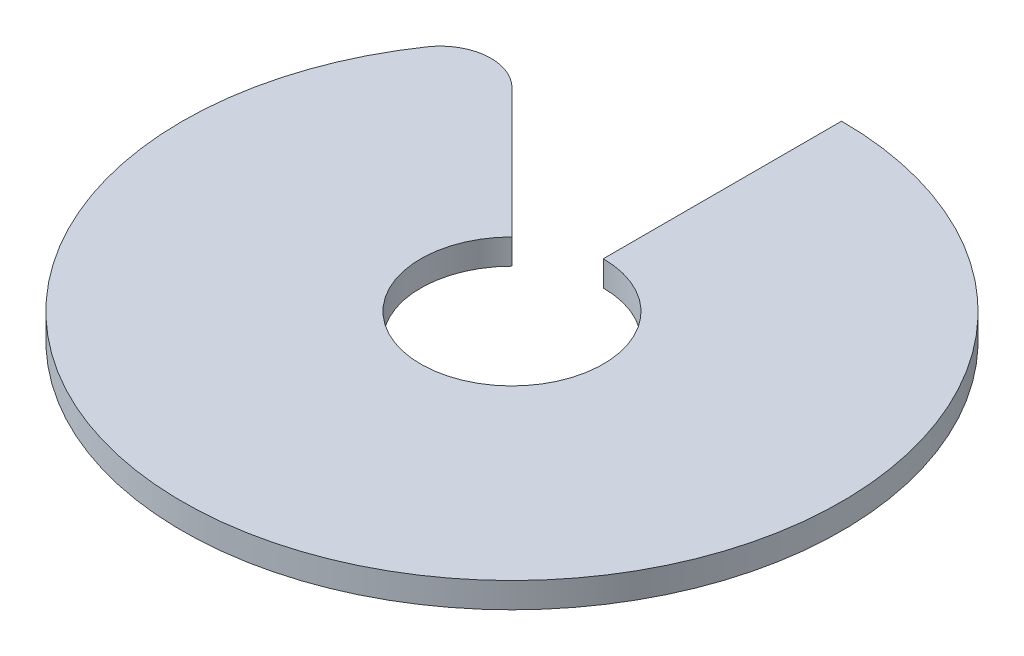
ISO-10303-21;
HEADER;
FILE_DESCRIPTION(('STEP AP214'),'2;1');
FILE_NAME('part.step','',(''),(''),'','','');
FILE_SCHEMA(('AUTOMOTIVE_DESIGN { 1 0 10303 214 1 1 1 1 }'));
ENDSEC;
DATA;
#1=APPLICATION_CONTEXT('core data for automotive mechanical design processes');
#2=APPLICATION_PROTOCOL_DEFINITION('international standard','automotive_design',2000,#1);
#3=PRODUCT_CONTEXT('',#1,'mechanical');
#4=PRODUCT('Part','Part','',(#3));
#5=PRODUCT_RELATED_PRODUCT_CATEGORY('part','',(#4));
#6=PRODUCT_DEFINITION_FORMATION('','',#4);
#7=PRODUCT_DEFINITION_CONTEXT('part definition',#1,'design');
#8=PRODUCT_DEFINITION('design','',#6,#7);
#9=PRODUCT_DEFINITION_SHAPE('','',#8);
#10=(LENGTH_UNIT() NAMED_UNIT(*) SI_UNIT(.MILLI.,.METRE.));
#11=(NAMED_UNIT(*) PLANE_ANGLE_UNIT() SI_UNIT($,.RADIAN.));
#12=(NAMED_UNIT(*) SI_UNIT($,.STERADIAN.) SOLID_ANGLE_UNIT());
#13=UNCERTAINTY_MEASURE_WITH_UNIT(LENGTH_MEASURE(1.E-05),#10,'distance_accuracy_value','');
#14=(GEOMETRIC_REPRESENTATION_CONTEXT(3) GLOBAL_UNCERTAINTY_ASSIGNED_CONTEXT((#13)) GLOBAL_UNIT_ASSIGNED_CONTEXT((#10,
#11,#12)) REPRESENTATION_CONTEXT('',''));
#15=CARTESIAN_POINT('',(0.,0.,0.));
#16=DIRECTION('',(0.,0.,1.));
#17=DIRECTION('',(1.,0.,0.));
#18=AXIS2_PLACEMENT_3D('',#15,#16,#17);
#19=CARTESIAN_POINT('',(-12.7279220613579,5.,-12.7279220613578));
#20=DIRECTION('',(-0.707106781186544,0.,0.707106781186551));
#21=DIRECTION('',(0.707106781186551,0.,0.707106781186544));
#22=AXIS2_PLACEMENT_3D('',#19,#20,#21);
#23=PLANE('',#22);
#24=DIRECTION('',(-0.707106781186551,0.,-0.707106781186544));
#25=VECTOR('',#24,1.);
#26=CARTESIAN_POINT('',(-12.7279220613579,0.,-12.7279220613578));
#27=LINE('',#26,#25);
#28=CARTESIAN_POINT('',(-12.7279220613579,0.,-12.7279220613578));
#29=VERTEX_POINT('',#28);
#30=CARTESIAN_POINT('',(-38.2426463519461,0.,-38.2426463519457));
#31=VERTEX_POINT('',#30);
#32=EDGE_CURVE('E117',#29,#31,#27,.T.);
#33=ORIENTED_EDGE('',*,*,#32,.T.);
#34=DIRECTION('',(0.,-1.,0.));
#35=VECTOR('',#34,1.);
#36=CARTESIAN_POINT('',(-38.2426463519461,5.,-38.2426463519457));
#37=LINE('',#36,#35);
#38=CARTESIAN_POINT('',(-38.2426463519461,5.,-38.2426463519457));
#39=VERTEX_POINT('',#38);
#40=EDGE_CURVE('E47',#31,#39,#37,.F.);
#41=ORIENTED_EDGE('',*,*,#40,.T.);
#42=DIRECTION('',(-0.707106781186551,0.,-0.707106781186544));
#43=VECTOR('',#42,1.);
#44=CARTESIAN_POINT('',(-12.7279220613579,5.,-12.7279220613578));
#45=LINE('',#44,#43);
#46=CARTESIAN_POINT('',(-12.7279220613579,5.,-12.7279220613578));
#47=VERTEX_POINT('',#46);
#48=EDGE_CURVE('E100',#47,#39,#45,.T.);
#49=ORIENTED_EDGE('',*,*,#48,.F.);
#50=DIRECTION('',(0.,-1.,0.));
#51=VECTOR('',#50,1.);
#52=CARTESIAN_POINT('',(-12.7279220613579,5.,-12.7279220613578));
#53=LINE('',#52,#51);
#54=EDGE_CURVE('E112',#47,#29,#53,.T.);
#55=ORIENTED_EDGE('',*,*,#54,.T.);
#56=EDGE_LOOP('',(#33,#41,#49,#55));
#57=FACE_BOUND('',#56,.T.);
#58=ADVANCED_FACE('F41',(#57),#23,.F.);
#59=CARTESIAN_POINT('',(0.,5.,0.));
#60=DIRECTION('',(0.,-1.,0.));
#61=DIRECTION('',(0.,0.,-1.));
#62=AXIS2_PLACEMENT_3D('',#59,#60,#61);
#63=CYLINDRICAL_SURFACE('',#62,65.);
#64=CARTESIAN_POINT('',(0.,5.,0.));
#65=DIRECTION('',(0.,1.,0.));
#66=DIRECTION('',(0.,0.,1.));
#67=AXIS2_PLACEMENT_3D('',#64,#65,#66);
#68=CIRCLE('',#67,65.);
#69=CARTESIAN_POINT('',(-53.5525712845045,5.,-36.8391382746402));
#70=VERTEX_POINT('',#69);
#71=CARTESIAN_POINT('',(0.,5.,-65.));
#72=VERTEX_POINT('',#71);
#73=EDGE_CURVE('E86',#70,#72,#68,.T.);
#74=ORIENTED_EDGE('',*,*,#73,.F.);
#75=DIRECTION('',(0.,-1.,0.));
#76=VECTOR('',#75,1.);
#77=CARTESIAN_POINT('',(-53.5525712845045,5.,-36.8391382746402));
#78=LINE('',#77,#76);
#79=CARTESIAN_POINT('',(-53.5525712845045,0.,-36.8391382746402));
#80=VERTEX_POINT('',#79);
#81=EDGE_CURVE('E108',#70,#80,#78,.T.);
#82=ORIENTED_EDGE('',*,*,#81,.T.);
#83=CARTESIAN_POINT('',(0.,0.,0.));
#84=DIRECTION('',(0.,1.,0.));
#85=DIRECTION('',(0.,0.,1.));
#86=AXIS2_PLACEMENT_3D('',#83,#84,#85);
#87=CIRCLE('',#86,65.);
#88=CARTESIAN_POINT('',(0.,0.,-65.));
#89=VERTEX_POINT('',#88);
#90=EDGE_CURVE('E104',#80,#89,#87,.T.);
#91=ORIENTED_EDGE('',*,*,#90,.T.);
#92=DIRECTION('',(0.,-1.,0.));
#93=VECTOR('',#92,1.);
#94=CARTESIAN_POINT('',(0.,5.,-65.));
#95=LINE('',#94,#93);
#96=EDGE_CURVE('E105',#72,#89,#95,.T.);
#97=ORIENTED_EDGE('',*,*,#96,.F.);
#98=EDGE_LOOP('',(#74,#82,#91,#97));
#99=FACE_BOUND('',#98,.T.);
#100=ADVANCED_FACE('F101',(#99),#63,.T.);
#101=CARTESIAN_POINT('',(0.,5.,-18.));
#102=DIRECTION('',(-1.,0.,0.));
#103=DIRECTION('',(0.,0.,1.));
#104=AXIS2_PLACEMENT_3D('',#101,#102,#103);
#105=PLANE('',#104);
#106=DIRECTION('',(0.,0.,-1.));
#107=VECTOR('',#106,1.);
#108=CARTESIAN_POINT('',(0.,0.,-18.));
#109=LINE('',#108,#107);
#110=CARTESIAN_POINT('',(0.,0.,-18.));
#111=VERTEX_POINT('',#110);
#112=EDGE_CURVE('E122',#111,#89,#109,.T.);
#113=ORIENTED_EDGE('',*,*,#112,.F.);
#114=DIRECTION('',(0.,-1.,0.));
#115=VECTOR('',#114,1.);
#116=CARTESIAN_POINT('',(0.,5.,-18.));
#117=LINE('',#116,#115);
#118=CARTESIAN_POINT('',(0.,5.,-18.));
#119=VERTEX_POINT('',#118);
#120=EDGE_CURVE('E107',#119,#111,#117,.T.);
#121=ORIENTED_EDGE('',*,*,#120,.F.);
#122=DIRECTION('',(0.,0.,-1.));
#123=VECTOR('',#122,1.);
#124=CARTESIAN_POINT('',(0.,5.,-18.));
#125=LINE('',#124,#123);
#126=EDGE_CURVE('E91',#119,#72,#125,.T.);
#127=ORIENTED_EDGE('',*,*,#126,.T.);
#128=ORIENTED_EDGE('',*,*,#96,.T.);
#129=EDGE_LOOP('',(#113,#121,#127,#128));
#130=FACE_BOUND('',#129,.T.);
#131=ADVANCED_FACE('F111',(#130),#105,.T.);
#132=CARTESIAN_POINT('',(0.,5.,0.));
#133=DIRECTION('',(0.,-1.,0.));
#134=DIRECTION('',(0.,0.,-1.));
#135=AXIS2_PLACEMENT_3D('',#132,#133,#134);
#136=CYLINDRICAL_SURFACE('',#135,18.);
#137=CARTESIAN_POINT('',(0.,0.,0.));
#138=DIRECTION('',(0.,1.,0.));
#139=DIRECTION('',(0.,0.,1.));
#140=AXIS2_PLACEMENT_3D('',#137,#138,#139);
#141=CIRCLE('',#140,18.);
#142=EDGE_CURVE('E124',#29,#111,#141,.T.);
#143=ORIENTED_EDGE('',*,*,#142,.F.);
#144=ORIENTED_EDGE('',*,*,#54,.F.);
#145=CARTESIAN_POINT('',(0.,5.,0.));
#146=DIRECTION('',(0.,1.,0.));
#147=DIRECTION('',(0.,0.,1.));
#148=AXIS2_PLACEMENT_3D('',#145,#146,#147);
#149=CIRCLE('',#148,18.);
#150=EDGE_CURVE('E115',#47,#119,#149,.T.);
#151=ORIENTED_EDGE('',*,*,#150,.T.);
#152=ORIENTED_EDGE('',*,*,#120,.T.);
#153=EDGE_LOOP('',(#143,#144,#151,#152));
#154=FACE_BOUND('',#153,.T.);
#155=ADVANCED_FACE('F131',(#154),#136,.F.);
#156=CARTESIAN_POINT('',(0.,5.,0.));
#157=DIRECTION('',(0.,1.,0.));
#158=DIRECTION('',(0.,0.,1.));
#159=AXIS2_PLACEMENT_3D('',#156,#157,#158);
#160=PLANE('',#159);
#161=ORIENTED_EDGE('',*,*,#48,.T.);
#162=CARTESIAN_POINT('',(-45.3137141638115,5.,-31.1715785400801));
#163=DIRECTION('',(0.,1.,0.));
#164=DIRECTION('',(0.,0.,1.));
#165=AXIS2_PLACEMENT_3D('',#162,#163,#164);
#166=CIRCLE('',#165,10.);
#167=EDGE_CURVE('E11',#39,#70,#166,.T.);
#168=ORIENTED_EDGE('',*,*,#167,.T.);
#169=ORIENTED_EDGE('',*,*,#73,.T.);
#170=ORIENTED_EDGE('',*,*,#126,.F.);
#171=ORIENTED_EDGE('',*,*,#150,.F.);
#172=EDGE_LOOP('',(#161,#168,#169,#170,#171));
#173=FACE_BOUND('',#172,.T.);
#174=ADVANCED_FACE('F87',(#173),#160,.T.);
#175=CARTESIAN_POINT('',(0.,0.,0.));
#176=DIRECTION('',(0.,1.,0.));
#177=DIRECTION('',(0.,0.,1.));
#178=AXIS2_PLACEMENT_3D('',#175,#176,#177);
#179=PLANE('',#178);
#180=ORIENTED_EDGE('',*,*,#90,.F.);
#181=CARTESIAN_POINT('',(-45.3137141638115,0.,-31.1715785400801));
#182=DIRECTION('',(0.,1.,0.));
#183=DIRECTION('',(0.,0.,1.));
#184=AXIS2_PLACEMENT_3D('',#181,#182,#183);
#185=CIRCLE('',#184,10.);
#186=EDGE_CURVE('E61',#80,#31,#185,.F.);
#187=ORIENTED_EDGE('',*,*,#186,.T.);
#188=ORIENTED_EDGE('',*,*,#32,.F.);
#189=ORIENTED_EDGE('',*,*,#142,.T.);
#190=ORIENTED_EDGE('',*,*,#112,.T.);
#191=EDGE_LOOP('',(#180,#187,#188,#189,#190));
#192=FACE_BOUND('',#191,.T.);
#193=ADVANCED_FACE('F129',(#192),#179,.F.);
#194=CARTESIAN_POINT('',(-45.3137141638115,5.,-31.1715785400801));
#195=DIRECTION('',(0.,-1.,0.));
#196=DIRECTION('',(0.,0.,-1.));
#197=AXIS2_PLACEMENT_3D('',#194,#195,#196);
#198=CYLINDRICAL_SURFACE('',#197,10.);
#199=ORIENTED_EDGE('',*,*,#167,.F.);
#200=ORIENTED_EDGE('',*,*,#40,.F.);
#201=ORIENTED_EDGE('',*,*,#186,.F.);
#202=ORIENTED_EDGE('',*,*,#81,.F.);
#203=EDGE_LOOP('',(#199,#200,#201,#202));
#204=FACE_BOUND('',#203,.T.);
#205=ADVANCED_FACE('F43',(#204),#198,.T.);
#206=CLOSED_SHELL('',(#58,#100,#131,#155,#174,#193,#205));
#207=MANIFOLD_SOLID_BREP('B2',#206);
#208=ADVANCED_BREP_SHAPE_REPRESENTATION('',(#18,#207),#14);
#209=SHAPE_DEFINITION_REPRESENTATION(#9,#208);
ENDSEC;
END-ISO-10303-21;
